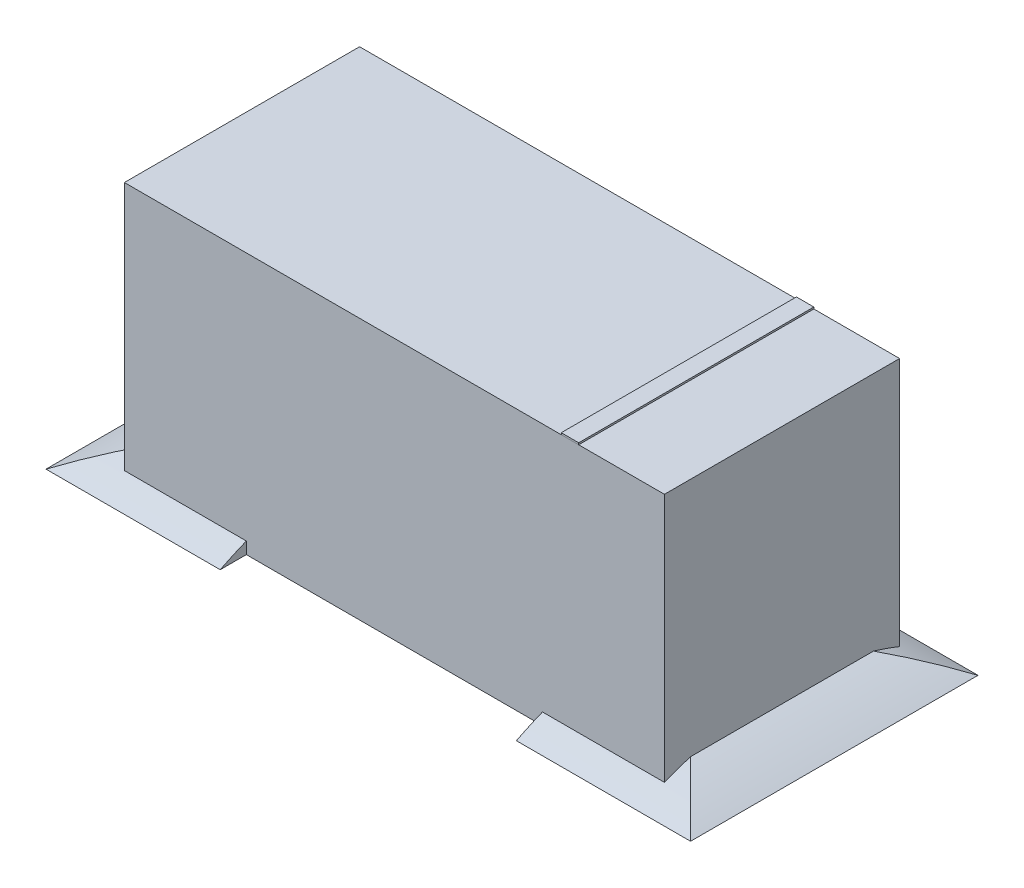
ISO-10303-21;
HEADER;
FILE_DESCRIPTION(('STEP AP214'),'2;1');
FILE_NAME('part.step','',(''),(''),'','','');
FILE_SCHEMA(('AUTOMOTIVE_DESIGN { 1 0 10303 214 1 1 1 1 }'));
ENDSEC;
DATA;
#1=APPLICATION_CONTEXT('core data for automotive mechanical design processes');
#2=APPLICATION_PROTOCOL_DEFINITION('international standard','automotive_design',2000,#1);
#3=PRODUCT_CONTEXT('',#1,'mechanical');
#4=PRODUCT('Part','Part','',(#3));
#5=PRODUCT_RELATED_PRODUCT_CATEGORY('part','',(#4));
#6=PRODUCT_DEFINITION_FORMATION('','',#4);
#7=PRODUCT_DEFINITION_CONTEXT('part definition',#1,'design');
#8=PRODUCT_DEFINITION('design','',#6,#7);
#9=PRODUCT_DEFINITION_SHAPE('','',#8);
#10=(LENGTH_UNIT() NAMED_UNIT(*) SI_UNIT(.MILLI.,.METRE.));
#11=(NAMED_UNIT(*) PLANE_ANGLE_UNIT() SI_UNIT($,.RADIAN.));
#12=(NAMED_UNIT(*) SI_UNIT($,.STERADIAN.) SOLID_ANGLE_UNIT());
#13=UNCERTAINTY_MEASURE_WITH_UNIT(LENGTH_MEASURE(1.E-05),#10,'distance_accuracy_value','');
#14=(GEOMETRIC_REPRESENTATION_CONTEXT(3) GLOBAL_UNCERTAINTY_ASSIGNED_CONTEXT((#13)) GLOBAL_UNIT_ASSIGNED_CONTEXT((#10,
#11,#12)) REPRESENTATION_CONTEXT('',''));
#15=CARTESIAN_POINT('',(0.,0.,0.));
#16=DIRECTION('',(0.,0.,1.));
#17=DIRECTION('',(1.,0.,0.));
#18=AXIS2_PLACEMENT_3D('',#15,#16,#17);
#19=CARTESIAN_POINT('',(28.1,0.,38.65));
#20=DIRECTION('',(0.,0.,-1.));
#21=DIRECTION('',(-1.,0.,0.));
#22=AXIS2_PLACEMENT_3D('',#19,#20,#21);
#23=PLANE('',#22);
#24=DIRECTION('',(1.,0.,0.));
#25=VECTOR('',#24,1.);
#26=CARTESIAN_POINT('',(26.7,1.5,38.65));
#27=LINE('',#26,#25);
#28=CARTESIAN_POINT('',(28.1,1.5,38.65));
#29=VERTEX_POINT('',#28);
#30=CARTESIAN_POINT('',(25.,1.5,38.65));
#31=VERTEX_POINT('',#30);
#32=EDGE_CURVE('P0_E54',#29,#31,#27,.F.);
#33=ORIENTED_EDGE('',*,*,#32,.F.);
#34=DIRECTION('',(0.,1.,0.));
#35=VECTOR('',#34,1.);
#36=CARTESIAN_POINT('',(28.1,0.,38.65));
#37=LINE('',#36,#35);
#38=CARTESIAN_POINT('',(28.1,0.,38.65));
#39=VERTEX_POINT('',#38);
#40=EDGE_CURVE('P0_E67',#39,#29,#37,.T.);
#41=ORIENTED_EDGE('',*,*,#40,.F.);
#42=DIRECTION('',(1.,0.,0.));
#43=VECTOR('',#42,1.);
#44=CARTESIAN_POINT('',(26.7,0.,38.65));
#45=LINE('',#44,#43);
#46=CARTESIAN_POINT('',(25.,0.,38.65));
#47=VERTEX_POINT('',#46);
#48=EDGE_CURVE('P0_E60',#39,#47,#45,.F.);
#49=ORIENTED_EDGE('',*,*,#48,.T.);
#50=DIRECTION('',(0.,1.,0.));
#51=VECTOR('',#50,1.);
#52=CARTESIAN_POINT('',(25.,0.,38.65));
#53=LINE('',#52,#51);
#54=EDGE_CURVE('P0_E19',#47,#31,#53,.T.);
#55=ORIENTED_EDGE('',*,*,#54,.T.);
#56=EDGE_LOOP('',(#33,#41,#49,#55));
#57=FACE_BOUND('',#56,.T.);
#58=ADVANCED_FACE('P0_F16',(#57),#23,.T.);
#59=CARTESIAN_POINT('',(26.7,0.,39.3249977052212));
#60=DIRECTION('',(0.,1.,0.));
#61=DIRECTION('',(0.,0.,1.));
#62=AXIS2_PLACEMENT_3D('',#59,#60,#61);
#63=PLANE('',#62);
#64=DIRECTION('',(0.,0.,-1.));
#65=VECTOR('',#64,1.);
#66=CARTESIAN_POINT('',(28.1,0.,40.));
#67=LINE('',#66,#65);
#68=CARTESIAN_POINT('',(28.1,0.,40.));
#69=VERTEX_POINT('',#68);
#70=EDGE_CURVE('P0_E63',#69,#39,#67,.T.);
#71=ORIENTED_EDGE('',*,*,#70,.F.);
#72=DIRECTION('',(1.,0.,0.));
#73=VECTOR('',#72,1.);
#74=CARTESIAN_POINT('',(25.,0.,40.));
#75=LINE('',#74,#73);
#76=CARTESIAN_POINT('',(25.,0.,40.));
#77=VERTEX_POINT('',#76);
#78=EDGE_CURVE('P0_E82',#77,#69,#75,.T.);
#79=ORIENTED_EDGE('',*,*,#78,.F.);
#80=DIRECTION('',(0.,0.,1.));
#81=VECTOR('',#80,1.);
#82=CARTESIAN_POINT('',(25.,0.,38.65));
#83=LINE('',#82,#81);
#84=EDGE_CURVE('P0_E66',#47,#77,#83,.T.);
#85=ORIENTED_EDGE('',*,*,#84,.F.);
#86=ORIENTED_EDGE('',*,*,#48,.F.);
#87=EDGE_LOOP('',(#71,#79,#85,#86));
#88=FACE_BOUND('',#87,.T.);
#89=ADVANCED_FACE('P0_F61',(#88),#63,.F.);
#90=CARTESIAN_POINT('',(28.1,0.,40.));
#91=DIRECTION('',(1.,0.,0.));
#92=DIRECTION('',(0.,0.,-1.));
#93=AXIS2_PLACEMENT_3D('',#90,#91,#92);
#94=PLANE('',#93);
#95=DIRECTION('',(0.,0.,1.));
#96=VECTOR('',#95,1.);
#97=CARTESIAN_POINT('',(28.1,1.5,39.3249977052212));
#98=LINE('',#97,#96);
#99=CARTESIAN_POINT('',(28.1,1.5,40.));
#100=VERTEX_POINT('',#99);
#101=EDGE_CURVE('P0_E78',#100,#29,#98,.F.);
#102=ORIENTED_EDGE('',*,*,#101,.F.);
#103=DIRECTION('',(0.,1.,0.));
#104=VECTOR('',#103,1.);
#105=CARTESIAN_POINT('',(28.1,0.,40.));
#106=LINE('',#105,#104);
#107=EDGE_CURVE('P0_E73',#69,#100,#106,.T.);
#108=ORIENTED_EDGE('',*,*,#107,.F.);
#109=ORIENTED_EDGE('',*,*,#70,.T.);
#110=ORIENTED_EDGE('',*,*,#40,.T.);
#111=EDGE_LOOP('',(#102,#108,#109,#110));
#112=FACE_BOUND('',#111,.T.);
#113=ADVANCED_FACE('P0_F71',(#112),#94,.T.);
#114=CARTESIAN_POINT('',(26.7,1.5,39.3249977052212));
#115=DIRECTION('',(0.,1.,0.));
#116=DIRECTION('',(0.,0.,1.));
#117=AXIS2_PLACEMENT_3D('',#114,#115,#116);
#118=PLANE('',#117);
#119=DIRECTION('',(1.,0.,0.));
#120=VECTOR('',#119,1.);
#121=CARTESIAN_POINT('',(25.,1.5,40.));
#122=LINE('',#121,#120);
#123=CARTESIAN_POINT('',(25.,1.5,40.));
#124=VERTEX_POINT('',#123);
#125=EDGE_CURVE('P0_E25',#100,#124,#122,.F.);
#126=ORIENTED_EDGE('',*,*,#125,.F.);
#127=ORIENTED_EDGE('',*,*,#101,.T.);
#128=ORIENTED_EDGE('',*,*,#32,.T.);
#129=DIRECTION('',(0.,0.,1.));
#130=VECTOR('',#129,1.);
#131=CARTESIAN_POINT('',(25.,1.5,38.65));
#132=LINE('',#131,#130);
#133=EDGE_CURVE('P0_E34',#124,#31,#132,.F.);
#134=ORIENTED_EDGE('',*,*,#133,.F.);
#135=EDGE_LOOP('',(#126,#127,#128,#134));
#136=FACE_BOUND('',#135,.T.);
#137=ADVANCED_FACE('P0_F88',(#136),#118,.T.);
#138=CARTESIAN_POINT('',(25.,0.,38.65));
#139=DIRECTION('',(-1.,0.,0.));
#140=DIRECTION('',(0.,0.,1.));
#141=AXIS2_PLACEMENT_3D('',#138,#139,#140);
#142=PLANE('',#141);
#143=ORIENTED_EDGE('',*,*,#133,.T.);
#144=ORIENTED_EDGE('',*,*,#54,.F.);
#145=ORIENTED_EDGE('',*,*,#84,.T.);
#146=DIRECTION('',(0.,1.,0.));
#147=VECTOR('',#146,1.);
#148=CARTESIAN_POINT('',(25.,0.,40.));
#149=LINE('',#148,#147);
#150=EDGE_CURVE('P0_E11',#124,#77,#149,.F.);
#151=ORIENTED_EDGE('',*,*,#150,.F.);
#152=EDGE_LOOP('',(#143,#144,#145,#151));
#153=FACE_BOUND('',#152,.T.);
#154=ADVANCED_FACE('P0_F90',(#153),#142,.T.);
#155=CARTESIAN_POINT('',(25.,0.,40.));
#156=DIRECTION('',(0.,0.,1.));
#157=DIRECTION('',(1.,0.,0.));
#158=AXIS2_PLACEMENT_3D('',#155,#156,#157);
#159=PLANE('',#158);
#160=ORIENTED_EDGE('',*,*,#125,.T.);
#161=ORIENTED_EDGE('',*,*,#150,.T.);
#162=ORIENTED_EDGE('',*,*,#78,.T.);
#163=ORIENTED_EDGE('',*,*,#107,.T.);
#164=EDGE_LOOP('',(#160,#161,#162,#163));
#165=FACE_BOUND('',#164,.T.);
#166=ADVANCED_FACE('P0_F87',(#165),#159,.T.);
#167=CLOSED_SHELL('',(#58,#89,#113,#137,#154,#166));
#168=MANIFOLD_SOLID_BREP('P0_B1',#167);
#169=CARTESIAN_POINT('',(28.1,0.,40.));
#170=DIRECTION('',(1.,0.,0.));
#171=DIRECTION('',(0.,0.,-1.));
#172=AXIS2_PLACEMENT_3D('',#169,#170,#171);
#173=PLANE('',#172);
#174=DIRECTION('',(0.,1.,0.));
#175=VECTOR('',#174,1.);
#176=CARTESIAN_POINT('',(28.1,0.,38.65));
#177=LINE('',#176,#175);
#178=CARTESIAN_POINT('',(28.1,0.06787973993477,38.65));
#179=VERTEX_POINT('',#178);
#180=CARTESIAN_POINT('',(28.1,0.,38.65));
#181=VERTEX_POINT('',#180);
#182=EDGE_CURVE('P1_E109',#179,#181,#177,.F.);
#183=ORIENTED_EDGE('',*,*,#182,.T.);
#184=DIRECTION('',(0.,0.,1.));
#185=VECTOR('',#184,1.);
#186=CARTESIAN_POINT('',(28.1,0.,39.3249977052212));
#187=LINE('',#186,#185);
#188=CARTESIAN_POINT('',(28.1,0.,40.));
#189=VERTEX_POINT('',#188);
#190=EDGE_CURVE('P1_E179',#181,#189,#187,.T.);
#191=ORIENTED_EDGE('',*,*,#190,.T.);
#192=DIRECTION('',(0.,1.,0.));
#193=VECTOR('',#192,1.);
#194=CARTESIAN_POINT('',(28.1,0.,40.));
#195=LINE('',#194,#193);
#196=CARTESIAN_POINT('',(28.1,0.067845993239552,40.));
#197=VERTEX_POINT('',#196);
#198=EDGE_CURVE('P1_E88',#189,#197,#195,.T.);
#199=ORIENTED_EDGE('',*,*,#198,.T.);
#200=CARTESIAN_POINT('',(28.1,-1.65,39.3133376786871));
#201=DIRECTION('',(-1.,0.,0.));
#202=DIRECTION('',(0.,0.,1.));
#203=AXIS2_PLACEMENT_3D('',#200,#201,#202);
#204=CIRCLE('',#203,1.85);
#205=CARTESIAN_POINT('',(28.1000000000018,0.120450794548806,39.849997705223));
#206=VERTEX_POINT('',#205);
#207=EDGE_CURVE('P1_E19',#206,#197,#204,.F.);
#208=ORIENTED_EDGE('',*,*,#207,.F.);
#209=DIRECTION('',(0.,0.,1.));
#210=VECTOR('',#209,1.);
#211=CARTESIAN_POINT('',(28.1000000000036,0.120450794548263,38.4999977052212));
#212=LINE('',#211,#210);
#213=CARTESIAN_POINT('',(28.1000000000018,0.120450794548263,38.7997978527455));
#214=VERTEX_POINT('',#213);
#215=EDGE_CURVE('P1_E72',#214,#206,#212,.T.);
#216=ORIENTED_EDGE('',*,*,#215,.F.);
#217=CARTESIAN_POINT('',(28.1,-1.64984924338156,39.3369549765997));
#218=DIRECTION('',(-1.,0.,0.));
#219=DIRECTION('',(0.,0.,1.));
#220=AXIS2_PLACEMENT_3D('',#217,#218,#219);
#221=CIRCLE('',#220,1.85);
#222=EDGE_CURVE('P1_E97',#179,#214,#221,.F.);
#223=ORIENTED_EDGE('',*,*,#222,.F.);
#224=EDGE_LOOP('',(#183,#191,#199,#208,#216,#223));
#225=FACE_BOUND('',#224,.T.);
#226=ADVANCED_FACE('P1_F16',(#225),#173,.F.);
#227=CARTESIAN_POINT('',(25.,0.,40.));
#228=DIRECTION('',(0.,0.,1.));
#229=DIRECTION('',(1.,0.,0.));
#230=AXIS2_PLACEMENT_3D('',#227,#228,#229);
#231=PLANE('',#230);
#232=ORIENTED_EDGE('',*,*,#198,.F.);
#233=DIRECTION('',(1.,0.,0.));
#234=VECTOR('',#233,1.);
#235=CARTESIAN_POINT('',(26.7,0.,40.));
#236=LINE('',#235,#234);
#237=CARTESIAN_POINT('',(27.4,0.,40.));
#238=VERTEX_POINT('',#237);
#239=EDGE_CURVE('P1_E171',#189,#238,#236,.F.);
#240=ORIENTED_EDGE('',*,*,#239,.T.);
#241=DIRECTION('',(0.,1.,0.));
#242=VECTOR('',#241,1.);
#243=CARTESIAN_POINT('',(27.4,0.,40.));
#244=LINE('',#243,#242);
#245=CARTESIAN_POINT('',(27.4,0.067845993239552,40.));
#246=VERTEX_POINT('',#245);
#247=EDGE_CURVE('P1_E92',#246,#238,#244,.F.);
#248=ORIENTED_EDGE('',*,*,#247,.F.);
#249=DIRECTION('',(-1.,0.,0.));
#250=VECTOR('',#249,1.);
#251=CARTESIAN_POINT('',(28.4,0.067845993239552,40.));
#252=LINE('',#251,#250);
#253=EDGE_CURVE('P1_E91',#197,#246,#252,.T.);
#254=ORIENTED_EDGE('',*,*,#253,.F.);
#255=EDGE_LOOP('',(#232,#240,#248,#254));
#256=FACE_BOUND('',#255,.T.);
#257=ADVANCED_FACE('P1_F125',(#256),#231,.F.);
#258=CARTESIAN_POINT('',(27.4,0.,38.4999977052212));
#259=DIRECTION('',(-1.,0.,0.));
#260=DIRECTION('',(0.,0.,1.));
#261=AXIS2_PLACEMENT_3D('',#258,#259,#260);
#262=PLANE('',#261);
#263=DIRECTION('',(0.,0.,1.));
#264=VECTOR('',#263,1.);
#265=CARTESIAN_POINT('',(27.4,0.,39.3249977052212));
#266=LINE('',#265,#264);
#267=CARTESIAN_POINT('',(27.4,0.,40.1499977052212));
#268=VERTEX_POINT('',#267);
#269=EDGE_CURVE('P1_E168',#238,#268,#266,.T.);
#270=ORIENTED_EDGE('',*,*,#269,.T.);
#271=CARTESIAN_POINT('',(27.4,-1.65,39.3133376786871));
#272=DIRECTION('',(-1.,0.,0.));
#273=DIRECTION('',(0.,0.,1.));
#274=AXIS2_PLACEMENT_3D('',#271,#272,#273);
#275=CIRCLE('',#274,1.85);
#276=EDGE_CURVE('P1_E82',#246,#268,#275,.F.);
#277=ORIENTED_EDGE('',*,*,#276,.F.);
#278=ORIENTED_EDGE('',*,*,#247,.T.);
#279=EDGE_LOOP('',(#270,#277,#278));
#280=FACE_BOUND('',#279,.T.);
#281=ADVANCED_FACE('P1_F123',(#280),#262,.T.);
#282=CARTESIAN_POINT('',(28.4,-1.65,39.3133376786871));
#283=DIRECTION('',(-1.,0.,0.));
#284=DIRECTION('',(0.,0.,1.));
#285=AXIS2_PLACEMENT_3D('',#282,#283,#284);
#286=CYLINDRICAL_SURFACE('',#285,1.85);
#287=DIRECTION('',(1.,0.,0.));
#288=VECTOR('',#287,1.);
#289=CARTESIAN_POINT('',(26.7,0.,40.1499977052212));
#290=LINE('',#289,#288);
#291=CARTESIAN_POINT('',(28.4,0.,40.1499977052212));
#292=VERTEX_POINT('',#291);
#293=EDGE_CURVE('P1_E96',#268,#292,#290,.T.);
#294=ORIENTED_EDGE('',*,*,#293,.T.);
#295=CARTESIAN_POINT('',(27.5633399734659,-1.65,39.3133376786871));
#296=DIRECTION('',(-0.707106781186547,0.,0.707106781186547));
#297=DIRECTION('',(0.707106781186547,0.,0.707106781186547));
#298=AXIS2_PLACEMENT_3D('',#295,#296,#297);
#299=ELLIPSE('',#298,2.61629509039023,1.85);
#300=EDGE_CURVE('P1_E77',#206,#292,#299,.F.);
#301=ORIENTED_EDGE('',*,*,#300,.F.);
#302=ORIENTED_EDGE('',*,*,#207,.T.);
#303=ORIENTED_EDGE('',*,*,#253,.T.);
#304=ORIENTED_EDGE('',*,*,#276,.T.);
#305=EDGE_LOOP('',(#294,#301,#302,#303,#304));
#306=FACE_BOUND('',#305,.T.);
#307=ADVANCED_FACE('P1_F94',(#306),#286,.T.);
#308=CARTESIAN_POINT('',(27.5633399734659,-1.65,38.4999977052212));
#309=DIRECTION('',(0.,0.,1.));
#310=DIRECTION('',(1.,0.,0.));
#311=AXIS2_PLACEMENT_3D('',#308,#309,#310);
#312=CYLINDRICAL_SURFACE('',#311,1.85);
#313=DIRECTION('',(0.,0.,1.));
#314=VECTOR('',#313,1.);
#315=CARTESIAN_POINT('',(28.4,0.,39.3249977052212));
#316=LINE('',#315,#314);
#317=CARTESIAN_POINT('',(28.4,0.,38.4999977052212));
#318=VERTEX_POINT('',#317);
#319=EDGE_CURVE('P1_E156',#292,#318,#316,.F.);
#320=ORIENTED_EDGE('',*,*,#319,.T.);
#321=CARTESIAN_POINT('',(28.1000000000044,0.120450794548001,38.7997978527462));
#322=CARTESIAN_POINT('',(28.1254473764184,0.112736713867168,38.7743760245431));
#323=CARTESIAN_POINT('',(28.1508070773576,0.104451047700192,38.7490386486864));
#324=CARTESIAN_POINT('',(28.2012925444942,0.0867302166437844,38.6985929660023));
#325=CARTESIAN_POINT('',(28.2264185379402,0.0772963302012074,38.6734844372679));
#326=CARTESIAN_POINT('',(28.2764346350344,0.0572556423161995,38.6235000339492));
#327=CARTESIAN_POINT('',(28.3013247355072,0.0466488251087082,38.5986241624967));
#328=CARTESIAN_POINT('',(28.3508611985816,0.0242311020688975,38.5491137310395));
#329=CARTESIAN_POINT('',(28.3755072615628,0.0124188790699695,38.5244794679575));
#330=CARTESIAN_POINT('',(28.4,0.,38.4999977052212));
#331=B_SPLINE_CURVE_WITH_KNOTS('',3,(#321,#322,#323,#324,#325,#326,#327,#328,#329,#330),
.UNSPECIFIED.,.F.,.F.,(4,2,2,2,4),(0.,0.110360098884959,0.220598426225665,0.330838235431494,
0.441199822265285),.UNSPECIFIED.);
#332=EDGE_CURVE('P1_E79',#214,#318,#331,.T.);
#333=ORIENTED_EDGE('',*,*,#332,.F.);
#334=ORIENTED_EDGE('',*,*,#215,.T.);
#335=ORIENTED_EDGE('',*,*,#300,.T.);
#336=EDGE_LOOP('',(#320,#333,#334,#335));
#337=FACE_BOUND('',#336,.T.);
#338=ADVANCED_FACE('P1_F75',(#337),#312,.T.);
#339=CARTESIAN_POINT('',(28.4,-1.64984924338156,39.3369549765997));
#340=DIRECTION('',(-1.,0.,0.));
#341=DIRECTION('',(0.,0.,1.));
#342=AXIS2_PLACEMENT_3D('',#339,#340,#341);
#343=CYLINDRICAL_SURFACE('',#342,1.85);
#344=CARTESIAN_POINT('',(27.4,-1.64984924338156,39.3369549765997));
#345=DIRECTION('',(-1.,0.,0.));
#346=DIRECTION('',(0.,0.,1.));
#347=AXIS2_PLACEMENT_3D('',#344,#345,#346);
#348=CIRCLE('',#347,1.85);
#349=CARTESIAN_POINT('',(27.4,0.06787973993477,38.65));
#350=VERTEX_POINT('',#349);
#351=CARTESIAN_POINT('',(27.4,0.,38.4999977052212));
#352=VERTEX_POINT('',#351);
#353=EDGE_CURVE('P1_E108',#350,#352,#348,.T.);
#354=ORIENTED_EDGE('',*,*,#353,.F.);
#355=DIRECTION('',(-1.,0.,0.));
#356=VECTOR('',#355,1.);
#357=CARTESIAN_POINT('',(28.1,0.0678797399347811,38.65));
#358=LINE('',#357,#356);
#359=EDGE_CURVE('P1_E106',#350,#179,#358,.F.);
#360=ORIENTED_EDGE('',*,*,#359,.T.);
#361=ORIENTED_EDGE('',*,*,#222,.T.);
#362=ORIENTED_EDGE('',*,*,#332,.T.);
#363=DIRECTION('',(1.,0.,0.));
#364=VECTOR('',#363,1.);
#365=CARTESIAN_POINT('',(26.7,0.,38.4999977052212));
#366=LINE('',#365,#364);
#367=EDGE_CURVE('P1_E154',#318,#352,#366,.F.);
#368=ORIENTED_EDGE('',*,*,#367,.T.);
#369=EDGE_LOOP('',(#354,#360,#361,#362,#368));
#370=FACE_BOUND('',#369,.T.);
#371=ADVANCED_FACE('P1_F115',(#370),#343,.T.);
#372=CARTESIAN_POINT('',(27.4,0.,38.4999977052212));
#373=DIRECTION('',(-1.,0.,0.));
#374=DIRECTION('',(0.,0.,1.));
#375=AXIS2_PLACEMENT_3D('',#372,#373,#374);
#376=PLANE('',#375);
#377=ORIENTED_EDGE('',*,*,#353,.T.);
#378=DIRECTION('',(0.,0.,1.));
#379=VECTOR('',#378,1.);
#380=CARTESIAN_POINT('',(27.4,0.,39.3249977052212));
#381=LINE('',#380,#379);
#382=CARTESIAN_POINT('',(27.4,0.,38.65));
#383=VERTEX_POINT('',#382);
#384=EDGE_CURVE('P1_E25',#352,#383,#381,.T.);
#385=ORIENTED_EDGE('',*,*,#384,.T.);
#386=DIRECTION('',(0.,1.,0.));
#387=VECTOR('',#386,1.);
#388=CARTESIAN_POINT('',(27.4,0.,38.65));
#389=LINE('',#388,#387);
#390=EDGE_CURVE('P1_E33',#383,#350,#389,.T.);
#391=ORIENTED_EDGE('',*,*,#390,.T.);
#392=EDGE_LOOP('',(#377,#385,#391));
#393=FACE_BOUND('',#392,.T.);
#394=ADVANCED_FACE('P1_F141',(#393),#376,.T.);
#395=CARTESIAN_POINT('',(28.1,0.,38.65));
#396=DIRECTION('',(0.,0.,-1.));
#397=DIRECTION('',(-1.,0.,0.));
#398=AXIS2_PLACEMENT_3D('',#395,#396,#397);
#399=PLANE('',#398);
#400=ORIENTED_EDGE('',*,*,#390,.F.);
#401=DIRECTION('',(1.,0.,0.));
#402=VECTOR('',#401,1.);
#403=CARTESIAN_POINT('',(26.7,0.,38.65));
#404=LINE('',#403,#402);
#405=EDGE_CURVE('P1_E11',#383,#181,#404,.T.);
#406=ORIENTED_EDGE('',*,*,#405,.T.);
#407=ORIENTED_EDGE('',*,*,#182,.F.);
#408=ORIENTED_EDGE('',*,*,#359,.F.);
#409=EDGE_LOOP('',(#400,#406,#407,#408));
#410=FACE_BOUND('',#409,.T.);
#411=ADVANCED_FACE('P1_F135',(#410),#399,.F.);
#412=CARTESIAN_POINT('',(26.7,0.,39.3249977052212));
#413=DIRECTION('',(0.,1.,0.));
#414=DIRECTION('',(0.,0.,1.));
#415=AXIS2_PLACEMENT_3D('',#412,#413,#414);
#416=PLANE('',#415);
#417=ORIENTED_EDGE('',*,*,#384,.F.);
#418=ORIENTED_EDGE('',*,*,#367,.F.);
#419=ORIENTED_EDGE('',*,*,#319,.F.);
#420=ORIENTED_EDGE('',*,*,#293,.F.);
#421=ORIENTED_EDGE('',*,*,#269,.F.);
#422=ORIENTED_EDGE('',*,*,#239,.F.);
#423=ORIENTED_EDGE('',*,*,#190,.F.);
#424=ORIENTED_EDGE('',*,*,#405,.F.);
#425=EDGE_LOOP('',(#417,#418,#419,#420,#421,#422,#423,#424));
#426=FACE_BOUND('',#425,.T.);
#427=ADVANCED_FACE('P1_F133',(#426),#416,.F.);
#428=CLOSED_SHELL('',(#226,#257,#281,#307,#338,#371,#394,#411,#427));
#429=MANIFOLD_SOLID_BREP('P1_B1',#428);
#430=CARTESIAN_POINT('',(25.,0.,40.));
#431=DIRECTION('',(0.,0.,1.));
#432=DIRECTION('',(1.,0.,0.));
#433=AXIS2_PLACEMENT_3D('',#430,#431,#432);
#434=PLANE('',#433);
#435=DIRECTION('',(1.,0.,0.));
#436=VECTOR('',#435,1.);
#437=CARTESIAN_POINT('',(26.4,0.,40.));
#438=LINE('',#437,#436);
#439=CARTESIAN_POINT('',(25.,0.,40.));
#440=VERTEX_POINT('',#439);
#441=CARTESIAN_POINT('',(25.7,0.,40.));
#442=VERTEX_POINT('',#441);
#443=EDGE_CURVE('P2_E95',#440,#442,#438,.T.);
#444=ORIENTED_EDGE('',*,*,#443,.F.);
#445=DIRECTION('',(0.,1.,0.));
#446=VECTOR('',#445,1.);
#447=CARTESIAN_POINT('',(25.,0.,40.));
#448=LINE('',#447,#446);
#449=CARTESIAN_POINT('',(25.,0.0678459932395521,40.));
#450=VERTEX_POINT('',#449);
#451=EDGE_CURVE('P2_E116',#440,#450,#448,.T.);
#452=ORIENTED_EDGE('',*,*,#451,.T.);
#453=DIRECTION('',(-1.,0.,0.));
#454=VECTOR('',#453,1.);
#455=CARTESIAN_POINT('',(24.7,0.0678459932395522,40.));
#456=LINE('',#455,#454);
#457=CARTESIAN_POINT('',(25.7,0.0678459932395523,40.));
#458=VERTEX_POINT('',#457);
#459=EDGE_CURVE('P2_E82',#458,#450,#456,.T.);
#460=ORIENTED_EDGE('',*,*,#459,.F.);
#461=DIRECTION('',(0.,-1.,0.));
#462=VECTOR('',#461,1.);
#463=CARTESIAN_POINT('',(25.7,0.,40.));
#464=LINE('',#463,#462);
#465=EDGE_CURVE('P2_E78',#458,#442,#464,.T.);
#466=ORIENTED_EDGE('',*,*,#465,.T.);
#467=EDGE_LOOP('',(#444,#452,#460,#466));
#468=FACE_BOUND('',#467,.T.);
#469=ADVANCED_FACE('P2_F16',(#468),#434,.F.);
#470=CARTESIAN_POINT('',(25.7,0.,38.4999977052212));
#471=DIRECTION('',(-1.,0.,0.));
#472=DIRECTION('',(0.,-1.,0.));
#473=AXIS2_PLACEMENT_3D('',#470,#471,#472);
#474=PLANE('',#473);
#475=CARTESIAN_POINT('',(25.7,-1.65,39.3133376786871));
#476=DIRECTION('',(-1.,0.,0.));
#477=DIRECTION('',(0.,-1.,0.));
#478=AXIS2_PLACEMENT_3D('',#475,#476,#477);
#479=CIRCLE('',#478,1.85);
#480=CARTESIAN_POINT('',(25.7,0.,40.1499977052212));
#481=VERTEX_POINT('',#480);
#482=EDGE_CURVE('P2_E19',#481,#458,#479,.T.);
#483=ORIENTED_EDGE('',*,*,#482,.F.);
#484=DIRECTION('',(0.,0.,1.));
#485=VECTOR('',#484,1.);
#486=CARTESIAN_POINT('',(25.7,0.,39.3249977052212));
#487=LINE('',#486,#485);
#488=EDGE_CURVE('P2_E76',#442,#481,#487,.T.);
#489=ORIENTED_EDGE('',*,*,#488,.F.);
#490=ORIENTED_EDGE('',*,*,#465,.F.);
#491=EDGE_LOOP('',(#483,#489,#490));
#492=FACE_BOUND('',#491,.T.);
#493=ADVANCED_FACE('P2_F74',(#492),#474,.F.);
#494=CARTESIAN_POINT('',(24.7,-1.65,39.3133376786871));
#495=DIRECTION('',(-1.,0.,0.));
#496=DIRECTION('',(0.,-1.,0.));
#497=AXIS2_PLACEMENT_3D('',#494,#495,#496);
#498=CYLINDRICAL_SURFACE('',#497,1.85);
#499=DIRECTION('',(1.,0.,0.));
#500=VECTOR('',#499,1.);
#501=CARTESIAN_POINT('',(26.4,0.,40.1499977052212));
#502=LINE('',#501,#500);
#503=CARTESIAN_POINT('',(24.7,0.,40.1499977052212));
#504=VERTEX_POINT('',#503);
#505=EDGE_CURVE('P2_E84',#481,#504,#502,.F.);
#506=ORIENTED_EDGE('',*,*,#505,.F.);
#507=ORIENTED_EDGE('',*,*,#482,.T.);
#508=ORIENTED_EDGE('',*,*,#459,.T.);
#509=CARTESIAN_POINT('',(25.,-1.65,39.3133376786871));
#510=DIRECTION('',(-1.,0.,0.));
#511=DIRECTION('',(0.,-1.,0.));
#512=AXIS2_PLACEMENT_3D('',#509,#510,#511);
#513=CIRCLE('',#512,1.85);
#514=CARTESIAN_POINT('',(25.,0.120450794549353,39.8499977052212));
#515=VERTEX_POINT('',#514);
#516=EDGE_CURVE('P2_E97',#450,#515,#513,.T.);
#517=ORIENTED_EDGE('',*,*,#516,.T.);
#518=CARTESIAN_POINT('',(25.5366600265341,-1.65,39.3133376786871));
#519=DIRECTION('',(-0.707106781186547,0.,-0.707106781186547));
#520=DIRECTION('',(0.707106781186547,0.,-0.707106781186547));
#521=AXIS2_PLACEMENT_3D('',#518,#519,#520);
#522=ELLIPSE('',#521,2.61629509039023,1.85);
#523=EDGE_CURVE('P2_E81',#504,#515,#522,.T.);
#524=ORIENTED_EDGE('',*,*,#523,.F.);
#525=EDGE_LOOP('',(#506,#507,#508,#517,#524));
#526=FACE_BOUND('',#525,.T.);
#527=ADVANCED_FACE('P2_F85',(#526),#498,.T.);
#528=CARTESIAN_POINT('',(25.5366600265341,-1.65,38.4999977052212));
#529=DIRECTION('',(0.,0.,-1.));
#530=DIRECTION('',(-1.,0.,0.));
#531=AXIS2_PLACEMENT_3D('',#528,#529,#530);
#532=CYLINDRICAL_SURFACE('',#531,1.85);
#533=DIRECTION('',(0.,0.,1.));
#534=VECTOR('',#533,1.);
#535=CARTESIAN_POINT('',(24.7,0.,39.3249977052212));
#536=LINE('',#535,#534);
#537=CARTESIAN_POINT('',(24.7,0.,38.4999977052212));
#538=VERTEX_POINT('',#537);
#539=EDGE_CURVE('P2_E90',#504,#538,#536,.F.);
#540=ORIENTED_EDGE('',*,*,#539,.F.);
#541=ORIENTED_EDGE('',*,*,#523,.T.);
#542=DIRECTION('',(0.,0.,1.));
#543=VECTOR('',#542,1.);
#544=CARTESIAN_POINT('',(25.,0.120450794549357,38.65));
#545=LINE('',#544,#543);
#546=CARTESIAN_POINT('',(24.9999999999984,0.120450794548349,38.7997978527473));
#547=VERTEX_POINT('',#546);
#548=EDGE_CURVE('P2_E119',#515,#547,#545,.F.);
#549=ORIENTED_EDGE('',*,*,#548,.T.);
#550=CARTESIAN_POINT('',(24.7,0.,38.4999977052212));
#551=CARTESIAN_POINT('',(24.7244927384372,0.0124188790699676,38.5244794679575));
#552=CARTESIAN_POINT('',(24.7491388014184,0.0242311020688953,38.5491137310395));
#553=CARTESIAN_POINT('',(24.7986752644928,0.0466488251087062,38.5986241624967));
#554=CARTESIAN_POINT('',(24.8235653649656,0.0572556423161981,38.6235000339492));
#555=CARTESIAN_POINT('',(24.8735814620598,0.0772963302012062,38.6734844372679));
#556=CARTESIAN_POINT('',(24.8987074555058,0.0867302166437831,38.6985929660023));
#557=CARTESIAN_POINT('',(24.9491929226424,0.104451047700191,38.7490386486863));
#558=CARTESIAN_POINT('',(24.9745526235815,0.112736713867168,38.7743760245431));
#559=CARTESIAN_POINT('',(24.9999999999955,0.120450794548001,38.7997978527462));
#560=B_SPLINE_CURVE_WITH_KNOTS('',3,(#550,#551,#552,#553,#554,#555,#556,#557,#558,#559),
.UNSPECIFIED.,.F.,.F.,(4,2,2,2,4),(0.,0.110361586833791,0.220601396039625,0.330839723380323,
0.441199822265285),.UNSPECIFIED.);
#561=EDGE_CURVE('P2_E121',#538,#547,#560,.T.);
#562=ORIENTED_EDGE('',*,*,#561,.F.);
#563=EDGE_LOOP('',(#540,#541,#549,#562));
#564=FACE_BOUND('',#563,.T.);
#565=ADVANCED_FACE('P2_F131',(#564),#532,.T.);
#566=CARTESIAN_POINT('',(24.7,-1.64984924338156,39.3369549765997));
#567=DIRECTION('',(-1.,0.,0.));
#568=DIRECTION('',(0.,-1.,0.));
#569=AXIS2_PLACEMENT_3D('',#566,#567,#568);
#570=CYLINDRICAL_SURFACE('',#569,1.85);
#571=ORIENTED_EDGE('',*,*,#561,.T.);
#572=CARTESIAN_POINT('',(24.9999999999967,-1.64984924338156,39.3369549765997));
#573=DIRECTION('',(-1.,0.,0.));
#574=DIRECTION('',(0.,-1.,0.));
#575=AXIS2_PLACEMENT_3D('',#572,#573,#574);
#576=CIRCLE('',#575,1.85);
#577=CARTESIAN_POINT('',(24.9999999999984,0.0678797399347699,38.65));
#578=VERTEX_POINT('',#577);
#579=EDGE_CURVE('P2_E117',#547,#578,#576,.T.);
#580=ORIENTED_EDGE('',*,*,#579,.T.);
#581=DIRECTION('',(-1.,0.,0.));
#582=VECTOR('',#581,1.);
#583=CARTESIAN_POINT('',(28.1,0.0678797399347808,38.65));
#584=LINE('',#583,#582);
#585=CARTESIAN_POINT('',(25.7,0.06787973993477,38.65));
#586=VERTEX_POINT('',#585);
#587=EDGE_CURVE('P2_E111',#578,#586,#584,.F.);
#588=ORIENTED_EDGE('',*,*,#587,.T.);
#589=CARTESIAN_POINT('',(25.7,-1.64984924338156,39.3369549765997));
#590=DIRECTION('',(-1.,0.,0.));
#591=DIRECTION('',(0.,-1.,0.));
#592=AXIS2_PLACEMENT_3D('',#589,#590,#591);
#593=CIRCLE('',#592,1.85);
#594=CARTESIAN_POINT('',(25.7,0.,38.4999977052212));
#595=VERTEX_POINT('',#594);
#596=EDGE_CURVE('P2_E114',#586,#595,#593,.T.);
#597=ORIENTED_EDGE('',*,*,#596,.T.);
#598=DIRECTION('',(1.,0.,0.));
#599=VECTOR('',#598,1.);
#600=CARTESIAN_POINT('',(26.4,0.,38.4999977052212));
#601=LINE('',#600,#599);
#602=EDGE_CURVE('P2_E167',#538,#595,#601,.T.);
#603=ORIENTED_EDGE('',*,*,#602,.F.);
#604=EDGE_LOOP('',(#571,#580,#588,#597,#603));
#605=FACE_BOUND('',#604,.T.);
#606=ADVANCED_FACE('P2_F128',(#605),#570,.T.);
#607=CARTESIAN_POINT('',(25.7,0.,38.4999977052212));
#608=DIRECTION('',(-1.,0.,0.));
#609=DIRECTION('',(0.,-1.,0.));
#610=AXIS2_PLACEMENT_3D('',#607,#608,#609);
#611=PLANE('',#610);
#612=DIRECTION('',(0.,0.,1.));
#613=VECTOR('',#612,1.);
#614=CARTESIAN_POINT('',(25.7,0.,39.3249977052212));
#615=LINE('',#614,#613);
#616=CARTESIAN_POINT('',(25.7,0.,38.65));
#617=VERTEX_POINT('',#616);
#618=EDGE_CURVE('P2_E164',#595,#617,#615,.T.);
#619=ORIENTED_EDGE('',*,*,#618,.F.);
#620=ORIENTED_EDGE('',*,*,#596,.F.);
#621=DIRECTION('',(0.,1.,0.));
#622=VECTOR('',#621,1.);
#623=CARTESIAN_POINT('',(25.7,0.,38.65));
#624=LINE('',#623,#622);
#625=EDGE_CURVE('P2_E113',#586,#617,#624,.F.);
#626=ORIENTED_EDGE('',*,*,#625,.T.);
#627=EDGE_LOOP('',(#619,#620,#626));
#628=FACE_BOUND('',#627,.T.);
#629=ADVANCED_FACE('P2_F154',(#628),#611,.F.);
#630=CARTESIAN_POINT('',(28.1,0.,38.65));
#631=DIRECTION('',(0.,0.,-1.));
#632=DIRECTION('',(-1.,0.,0.));
#633=AXIS2_PLACEMENT_3D('',#630,#631,#632);
#634=PLANE('',#633);
#635=ORIENTED_EDGE('',*,*,#587,.F.);
#636=DIRECTION('',(0.,1.,0.));
#637=VECTOR('',#636,1.);
#638=CARTESIAN_POINT('',(25.,0.,38.65));
#639=LINE('',#638,#637);
#640=CARTESIAN_POINT('',(25.,0.,38.65));
#641=VERTEX_POINT('',#640);
#642=EDGE_CURVE('P2_E34',#578,#641,#639,.F.);
#643=ORIENTED_EDGE('',*,*,#642,.T.);
#644=DIRECTION('',(1.,0.,0.));
#645=VECTOR('',#644,1.);
#646=CARTESIAN_POINT('',(26.4,0.,38.65));
#647=LINE('',#646,#645);
#648=EDGE_CURVE('P2_E25',#617,#641,#647,.F.);
#649=ORIENTED_EDGE('',*,*,#648,.F.);
#650=ORIENTED_EDGE('',*,*,#625,.F.);
#651=EDGE_LOOP('',(#635,#643,#649,#650));
#652=FACE_BOUND('',#651,.T.);
#653=ADVANCED_FACE('P2_F149',(#652),#634,.F.);
#654=CARTESIAN_POINT('',(25.,0.,38.65));
#655=DIRECTION('',(-1.,0.,0.));
#656=DIRECTION('',(0.,0.,1.));
#657=AXIS2_PLACEMENT_3D('',#654,#655,#656);
#658=PLANE('',#657);
#659=ORIENTED_EDGE('',*,*,#451,.F.);
#660=DIRECTION('',(0.,0.,1.));
#661=VECTOR('',#660,1.);
#662=CARTESIAN_POINT('',(25.,0.,39.3249977052212));
#663=LINE('',#662,#661);
#664=EDGE_CURVE('P2_E11',#641,#440,#663,.T.);
#665=ORIENTED_EDGE('',*,*,#664,.F.);
#666=ORIENTED_EDGE('',*,*,#642,.F.);
#667=ORIENTED_EDGE('',*,*,#579,.F.);
#668=ORIENTED_EDGE('',*,*,#548,.F.);
#669=ORIENTED_EDGE('',*,*,#516,.F.);
#670=EDGE_LOOP('',(#659,#665,#666,#667,#668,#669));
#671=FACE_BOUND('',#670,.T.);
#672=ADVANCED_FACE('P2_F144',(#671),#658,.F.);
#673=CARTESIAN_POINT('',(26.4,0.,39.3249977052212));
#674=DIRECTION('',(0.,-1.,0.));
#675=DIRECTION('',(1.,0.,0.));
#676=AXIS2_PLACEMENT_3D('',#673,#674,#675);
#677=PLANE('',#676);
#678=ORIENTED_EDGE('',*,*,#648,.T.);
#679=ORIENTED_EDGE('',*,*,#664,.T.);
#680=ORIENTED_EDGE('',*,*,#443,.T.);
#681=ORIENTED_EDGE('',*,*,#488,.T.);
#682=ORIENTED_EDGE('',*,*,#505,.T.);
#683=ORIENTED_EDGE('',*,*,#539,.T.);
#684=ORIENTED_EDGE('',*,*,#602,.T.);
#685=ORIENTED_EDGE('',*,*,#618,.T.);
#686=EDGE_LOOP('',(#678,#679,#680,#681,#682,#683,#684,#685));
#687=FACE_BOUND('',#686,.T.);
#688=ADVANCED_FACE('P2_F93',(#687),#677,.T.);
#689=CLOSED_SHELL('',(#469,#493,#527,#565,#606,#629,#653,#672,#688));
#690=MANIFOLD_SOLID_BREP('P2_B1',#689);
#691=CARTESIAN_POINT('',(26.55,1.49999991059303,39.325));
#692=DIRECTION('',(0.,1.,0.));
#693=DIRECTION('',(0.,0.,1.));
#694=AXIS2_PLACEMENT_3D('',#691,#692,#693);
#695=PLANE('',#694);
#696=DIRECTION('',(1.,0.,0.));
#697=VECTOR('',#696,1.);
#698=CARTESIAN_POINT('',(26.55,1.49999991059303,40.));
#699=LINE('',#698,#697);
#700=CARTESIAN_POINT('',(27.5077345604836,1.49999991059303,40.));
#701=VERTEX_POINT('',#700);
#702=CARTESIAN_POINT('',(27.6077345604836,1.49999991059303,40.));
#703=VERTEX_POINT('',#702);
#704=EDGE_CURVE('P3_E19',#701,#703,#699,.T.);
#705=ORIENTED_EDGE('',*,*,#704,.F.);
#706=DIRECTION('',(0.,0.,1.));
#707=VECTOR('',#706,1.);
#708=CARTESIAN_POINT('',(27.5077345604836,1.49999991059303,38.65));
#709=LINE('',#708,#707);
#710=CARTESIAN_POINT('',(27.5077345604836,1.49999991059303,38.65));
#711=VERTEX_POINT('',#710);
#712=EDGE_CURVE('P3_E54',#711,#701,#709,.T.);
#713=ORIENTED_EDGE('',*,*,#712,.F.);
#714=DIRECTION('',(-1.,0.,0.));
#715=VECTOR('',#714,1.);
#716=CARTESIAN_POINT('',(27.6077345604836,1.49999991059303,38.65));
#717=LINE('',#716,#715);
#718=CARTESIAN_POINT('',(27.6077345604836,1.49999991059303,38.65));
#719=VERTEX_POINT('',#718);
#720=EDGE_CURVE('P3_E57',#719,#711,#717,.T.);
#721=ORIENTED_EDGE('',*,*,#720,.F.);
#722=DIRECTION('',(0.,0.,-1.));
#723=VECTOR('',#722,1.);
#724=CARTESIAN_POINT('',(27.6077345604836,1.49999991059303,40.));
#725=LINE('',#724,#723);
#726=EDGE_CURVE('P3_E59',#703,#719,#725,.T.);
#727=ORIENTED_EDGE('',*,*,#726,.F.);
#728=EDGE_LOOP('',(#705,#713,#721,#727));
#729=FACE_BOUND('',#728,.T.);
#730=ADVANCED_FACE('P3_F16',(#729),#695,.F.);
#731=CARTESIAN_POINT('',(27.6077345604836,1.49999991059303,40.));
#732=DIRECTION('',(1.,0.,0.));
#733=DIRECTION('',(0.,0.,-1.));
#734=AXIS2_PLACEMENT_3D('',#731,#732,#733);
#735=PLANE('',#734);
#736=DIRECTION('',(0.,0.,1.));
#737=VECTOR('',#736,1.);
#738=CARTESIAN_POINT('',(27.6077345604836,1.50999991059303,39.325));
#739=LINE('',#738,#737);
#740=CARTESIAN_POINT('',(27.6077345604836,1.50999991059303,40.));
#741=VERTEX_POINT('',#740);
#742=CARTESIAN_POINT('',(27.6077345604836,1.50999991059303,38.65));
#743=VERTEX_POINT('',#742);
#744=EDGE_CURVE('P3_E82',#741,#743,#739,.F.);
#745=ORIENTED_EDGE('',*,*,#744,.F.);
#746=DIRECTION('',(0.,1.,0.));
#747=VECTOR('',#746,1.);
#748=CARTESIAN_POINT('',(27.6077345604836,1.49999991059303,40.));
#749=LINE('',#748,#747);
#750=EDGE_CURVE('P3_E70',#703,#741,#749,.T.);
#751=ORIENTED_EDGE('',*,*,#750,.F.);
#752=ORIENTED_EDGE('',*,*,#726,.T.);
#753=DIRECTION('',(0.,1.,0.));
#754=VECTOR('',#753,1.);
#755=CARTESIAN_POINT('',(27.6077345604836,1.49999991059303,38.65));
#756=LINE('',#755,#754);
#757=EDGE_CURVE('P3_E64',#743,#719,#756,.F.);
#758=ORIENTED_EDGE('',*,*,#757,.F.);
#759=EDGE_LOOP('',(#745,#751,#752,#758));
#760=FACE_BOUND('',#759,.T.);
#761=ADVANCED_FACE('P3_F67',(#760),#735,.T.);
#762=CARTESIAN_POINT('',(27.6077345604836,1.49999991059303,38.65));
#763=DIRECTION('',(0.,0.,-1.));
#764=DIRECTION('',(-1.,0.,0.));
#765=AXIS2_PLACEMENT_3D('',#762,#763,#764);
#766=PLANE('',#765);
#767=DIRECTION('',(1.,0.,0.));
#768=VECTOR('',#767,1.);
#769=CARTESIAN_POINT('',(26.55,1.50999991059303,38.65));
#770=LINE('',#769,#768);
#771=CARTESIAN_POINT('',(27.5077345604836,1.50999991059303,38.65));
#772=VERTEX_POINT('',#771);
#773=EDGE_CURVE('P3_E73',#743,#772,#770,.F.);
#774=ORIENTED_EDGE('',*,*,#773,.F.);
#775=ORIENTED_EDGE('',*,*,#757,.T.);
#776=ORIENTED_EDGE('',*,*,#720,.T.);
#777=DIRECTION('',(0.,1.,0.));
#778=VECTOR('',#777,1.);
#779=CARTESIAN_POINT('',(27.5077345604836,1.49999991059303,38.65));
#780=LINE('',#779,#778);
#781=EDGE_CURVE('P3_E76',#772,#711,#780,.F.);
#782=ORIENTED_EDGE('',*,*,#781,.F.);
#783=EDGE_LOOP('',(#774,#775,#776,#782));
#784=FACE_BOUND('',#783,.T.);
#785=ADVANCED_FACE('P3_F71',(#784),#766,.T.);
#786=CARTESIAN_POINT('',(27.5077345604836,1.49999991059303,38.65));
#787=DIRECTION('',(-1.,0.,0.));
#788=DIRECTION('',(0.,0.,1.));
#789=AXIS2_PLACEMENT_3D('',#786,#787,#788);
#790=PLANE('',#789);
#791=DIRECTION('',(0.,0.,1.));
#792=VECTOR('',#791,1.);
#793=CARTESIAN_POINT('',(27.5077345604836,1.50999991059303,39.325));
#794=LINE('',#793,#792);
#795=CARTESIAN_POINT('',(27.5077345604836,1.50999991059303,40.));
#796=VERTEX_POINT('',#795);
#797=EDGE_CURVE('P3_E25',#772,#796,#794,.T.);
#798=ORIENTED_EDGE('',*,*,#797,.F.);
#799=ORIENTED_EDGE('',*,*,#781,.T.);
#800=ORIENTED_EDGE('',*,*,#712,.T.);
#801=DIRECTION('',(0.,1.,0.));
#802=VECTOR('',#801,1.);
#803=CARTESIAN_POINT('',(27.5077345604836,1.49999991059303,40.));
#804=LINE('',#803,#802);
#805=EDGE_CURVE('P3_E34',#796,#701,#804,.F.);
#806=ORIENTED_EDGE('',*,*,#805,.F.);
#807=EDGE_LOOP('',(#798,#799,#800,#806));
#808=FACE_BOUND('',#807,.T.);
#809=ADVANCED_FACE('P3_F88',(#808),#790,.T.);
#810=CARTESIAN_POINT('',(27.5077345604836,1.49999991059303,40.));
#811=DIRECTION('',(0.,0.,1.));
#812=DIRECTION('',(1.,0.,0.));
#813=AXIS2_PLACEMENT_3D('',#810,#811,#812);
#814=PLANE('',#813);
#815=DIRECTION('',(1.,0.,0.));
#816=VECTOR('',#815,1.);
#817=CARTESIAN_POINT('',(26.55,1.50999991059303,40.));
#818=LINE('',#817,#816);
#819=EDGE_CURVE('P3_E11',#796,#741,#818,.T.);
#820=ORIENTED_EDGE('',*,*,#819,.F.);
#821=ORIENTED_EDGE('',*,*,#805,.T.);
#822=ORIENTED_EDGE('',*,*,#704,.T.);
#823=ORIENTED_EDGE('',*,*,#750,.T.);
#824=EDGE_LOOP('',(#820,#821,#822,#823));
#825=FACE_BOUND('',#824,.T.);
#826=ADVANCED_FACE('P3_F90',(#825),#814,.T.);
#827=CARTESIAN_POINT('',(26.55,1.50999991059303,39.325));
#828=DIRECTION('',(0.,1.,0.));
#829=DIRECTION('',(0.,0.,1.));
#830=AXIS2_PLACEMENT_3D('',#827,#828,#829);
#831=PLANE('',#830);
#832=ORIENTED_EDGE('',*,*,#797,.T.);
#833=ORIENTED_EDGE('',*,*,#819,.T.);
#834=ORIENTED_EDGE('',*,*,#744,.T.);
#835=ORIENTED_EDGE('',*,*,#773,.T.);
#836=EDGE_LOOP('',(#832,#833,#834,#835));
#837=FACE_BOUND('',#836,.T.);
#838=ADVANCED_FACE('P3_F87',(#837),#831,.T.);
#839=CLOSED_SHELL('',(#730,#761,#785,#809,#826,#838));
#840=MANIFOLD_SOLID_BREP('P3_B1',#839);
#841=ADVANCED_BREP_SHAPE_REPRESENTATION('',(#18,#168,#429,#690,#840),#14);
#842=SHAPE_DEFINITION_REPRESENTATION(#9,#841);
ENDSEC;
END-ISO-10303-21;
